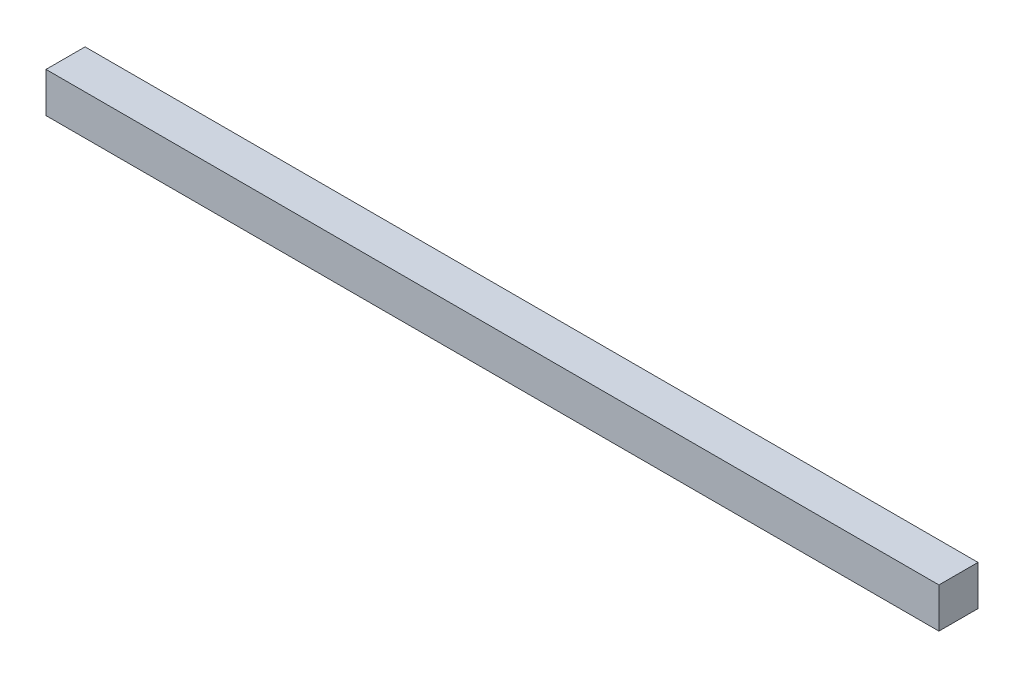
ISO-10303-21;
HEADER;
FILE_DESCRIPTION(('STEP AP214'),'2;1');
FILE_NAME('part.step','',(''),(''),'','','');
FILE_SCHEMA(('AUTOMOTIVE_DESIGN { 1 0 10303 214 1 1 1 1 }'));
ENDSEC;
DATA;
#1=APPLICATION_CONTEXT('core data for automotive mechanical design processes');
#2=APPLICATION_PROTOCOL_DEFINITION('international standard','automotive_design',2000,#1);
#3=PRODUCT_CONTEXT('',#1,'mechanical');
#4=PRODUCT('Part','Part','',(#3));
#5=PRODUCT_RELATED_PRODUCT_CATEGORY('part','',(#4));
#6=PRODUCT_DEFINITION_FORMATION('','',#4);
#7=PRODUCT_DEFINITION_CONTEXT('part definition',#1,'design');
#8=PRODUCT_DEFINITION('design','',#6,#7);
#9=PRODUCT_DEFINITION_SHAPE('','',#8);
#10=(LENGTH_UNIT() NAMED_UNIT(*) SI_UNIT(.MILLI.,.METRE.));
#11=(NAMED_UNIT(*) PLANE_ANGLE_UNIT() SI_UNIT($,.RADIAN.));
#12=(NAMED_UNIT(*) SI_UNIT($,.STERADIAN.) SOLID_ANGLE_UNIT());
#13=UNCERTAINTY_MEASURE_WITH_UNIT(LENGTH_MEASURE(1.E-05),#10,'distance_accuracy_value','');
#14=(GEOMETRIC_REPRESENTATION_CONTEXT(3) GLOBAL_UNCERTAINTY_ASSIGNED_CONTEXT((#13)) GLOBAL_UNIT_ASSIGNED_CONTEXT((#10,
#11,#12)) REPRESENTATION_CONTEXT('',''));
#15=CARTESIAN_POINT('',(0.,0.,0.));
#16=DIRECTION('',(0.,0.,1.));
#17=DIRECTION('',(1.,0.,0.));
#18=AXIS2_PLACEMENT_3D('',#15,#16,#17);
#19=CARTESIAN_POINT('',(-0.099999999999989,3.07499999999996,6.));
#20=DIRECTION('',(1.,0.,0.));
#21=DIRECTION('',(0.,1.,0.));
#22=AXIS2_PLACEMENT_3D('',#19,#20,#21);
#23=PLANE('',#22);
#24=DIRECTION('',(0.,-1.,0.));
#25=VECTOR('',#24,1.);
#26=CARTESIAN_POINT('',(-0.099999999999989,3.07499999999996,0.));
#27=LINE('',#26,#25);
#28=CARTESIAN_POINT('',(-0.099999999999989,3.07499999999996,0.));
#29=VERTEX_POINT('',#28);
#30=CARTESIAN_POINT('',(-0.0999999999999943,-3.07500000000001,0.));
#31=VERTEX_POINT('',#30);
#32=EDGE_CURVE('E104',#29,#31,#27,.T.);
#33=ORIENTED_EDGE('',*,*,#32,.T.);
#34=DIRECTION('',(0.,0.,-1.));
#35=VECTOR('',#34,1.);
#36=CARTESIAN_POINT('',(-0.0999999999999943,-3.07500000000001,6.));
#37=LINE('',#36,#35);
#38=CARTESIAN_POINT('',(-0.0999999999999943,-3.07500000000001,6.));
#39=VERTEX_POINT('',#38);
#40=EDGE_CURVE('E11',#39,#31,#37,.T.);
#41=ORIENTED_EDGE('',*,*,#40,.F.);
#42=DIRECTION('',(0.,-1.,0.));
#43=VECTOR('',#42,1.);
#44=CARTESIAN_POINT('',(-0.099999999999989,3.07499999999996,6.));
#45=LINE('',#44,#43);
#46=CARTESIAN_POINT('',(-0.099999999999989,3.07499999999996,6.));
#47=VERTEX_POINT('',#46);
#48=EDGE_CURVE('E92',#47,#39,#45,.T.);
#49=ORIENTED_EDGE('',*,*,#48,.F.);
#50=DIRECTION('',(0.,0.,-1.));
#51=VECTOR('',#50,1.);
#52=CARTESIAN_POINT('',(-0.099999999999989,3.07499999999996,6.));
#53=LINE('',#52,#51);
#54=EDGE_CURVE('E100',#47,#29,#53,.T.);
#55=ORIENTED_EDGE('',*,*,#54,.T.);
#56=EDGE_LOOP('',(#33,#41,#49,#55));
#57=FACE_BOUND('',#56,.T.);
#58=ADVANCED_FACE('F41',(#57),#23,.F.);
#59=CARTESIAN_POINT('',(-0.0999999999999943,-3.07500000000001,6.));
#60=DIRECTION('',(0.,1.,0.));
#61=DIRECTION('',(-1.,0.,0.));
#62=AXIS2_PLACEMENT_3D('',#59,#60,#61);
#63=PLANE('',#62);
#64=DIRECTION('',(1.,0.,0.));
#65=VECTOR('',#64,1.);
#66=CARTESIAN_POINT('',(-0.0999999999999943,-3.07500000000001,0.));
#67=LINE('',#66,#65);
#68=CARTESIAN_POINT('',(137.075,-3.07500000000001,0.));
#69=VERTEX_POINT('',#68);
#70=EDGE_CURVE('E96',#31,#69,#67,.T.);
#71=ORIENTED_EDGE('',*,*,#70,.T.);
#72=DIRECTION('',(0.,0.,-1.));
#73=VECTOR('',#72,1.);
#74=CARTESIAN_POINT('',(137.075,-3.07500000000001,6.));
#75=LINE('',#74,#73);
#76=CARTESIAN_POINT('',(137.075,-3.07500000000001,6.));
#77=VERTEX_POINT('',#76);
#78=EDGE_CURVE('E49',#77,#69,#75,.T.);
#79=ORIENTED_EDGE('',*,*,#78,.F.);
#80=DIRECTION('',(1.,0.,0.));
#81=VECTOR('',#80,1.);
#82=CARTESIAN_POINT('',(-0.0999999999999943,-3.07500000000001,6.));
#83=LINE('',#82,#81);
#84=EDGE_CURVE('E87',#39,#77,#83,.T.);
#85=ORIENTED_EDGE('',*,*,#84,.F.);
#86=ORIENTED_EDGE('',*,*,#40,.T.);
#87=EDGE_LOOP('',(#71,#79,#85,#86));
#88=FACE_BOUND('',#87,.T.);
#89=ADVANCED_FACE('F95',(#88),#63,.F.);
#90=CARTESIAN_POINT('',(137.075,-3.07500000000001,6.));
#91=DIRECTION('',(-1.,0.,0.));
#92=DIRECTION('',(0.,0.,1.));
#93=AXIS2_PLACEMENT_3D('',#90,#91,#92);
#94=PLANE('',#93);
#95=DIRECTION('',(0.,1.,0.));
#96=VECTOR('',#95,1.);
#97=CARTESIAN_POINT('',(137.075,-3.07500000000001,0.));
#98=LINE('',#97,#96);
#99=CARTESIAN_POINT('',(137.075,3.07499999999998,0.));
#100=VERTEX_POINT('',#99);
#101=EDGE_CURVE('E74',#69,#100,#98,.T.);
#102=ORIENTED_EDGE('',*,*,#101,.T.);
#103=DIRECTION('',(0.,0.,-1.));
#104=VECTOR('',#103,1.);
#105=CARTESIAN_POINT('',(137.075,3.07499999999998,6.));
#106=LINE('',#105,#104);
#107=CARTESIAN_POINT('',(137.075,3.07499999999998,6.));
#108=VERTEX_POINT('',#107);
#109=EDGE_CURVE('E97',#108,#100,#106,.T.);
#110=ORIENTED_EDGE('',*,*,#109,.F.);
#111=DIRECTION('',(0.,1.,0.));
#112=VECTOR('',#111,1.);
#113=CARTESIAN_POINT('',(137.075,-3.07500000000001,6.));
#114=LINE('',#113,#112);
#115=EDGE_CURVE('E90',#77,#108,#114,.T.);
#116=ORIENTED_EDGE('',*,*,#115,.F.);
#117=ORIENTED_EDGE('',*,*,#78,.T.);
#118=EDGE_LOOP('',(#102,#110,#116,#117));
#119=FACE_BOUND('',#118,.T.);
#120=ADVANCED_FACE('F98',(#119),#94,.F.);
#121=CARTESIAN_POINT('',(137.075,3.07499999999998,6.));
#122=DIRECTION('',(0.,-1.,0.));
#123=DIRECTION('',(1.,0.,0.));
#124=AXIS2_PLACEMENT_3D('',#121,#122,#123);
#125=PLANE('',#124);
#126=DIRECTION('',(-1.,0.,0.));
#127=VECTOR('',#126,1.);
#128=CARTESIAN_POINT('',(137.075,3.07499999999998,0.));
#129=LINE('',#128,#127);
#130=EDGE_CURVE('E80',#100,#29,#129,.T.);
#131=ORIENTED_EDGE('',*,*,#130,.T.);
#132=ORIENTED_EDGE('',*,*,#54,.F.);
#133=DIRECTION('',(-1.,0.,0.));
#134=VECTOR('',#133,1.);
#135=CARTESIAN_POINT('',(137.075,3.07499999999998,6.));
#136=LINE('',#135,#134);
#137=EDGE_CURVE('E57',#108,#47,#136,.T.);
#138=ORIENTED_EDGE('',*,*,#137,.F.);
#139=ORIENTED_EDGE('',*,*,#109,.T.);
#140=EDGE_LOOP('',(#131,#132,#138,#139));
#141=FACE_BOUND('',#140,.T.);
#142=ADVANCED_FACE('F111',(#141),#125,.F.);
#143=CARTESIAN_POINT('',(0.,0.,6.));
#144=DIRECTION('',(0.,0.,1.));
#145=DIRECTION('',(1.,0.,0.));
#146=AXIS2_PLACEMENT_3D('',#143,#144,#145);
#147=PLANE('',#146);
#148=ORIENTED_EDGE('',*,*,#48,.T.);
#149=ORIENTED_EDGE('',*,*,#84,.T.);
#150=ORIENTED_EDGE('',*,*,#115,.T.);
#151=ORIENTED_EDGE('',*,*,#137,.T.);
#152=EDGE_LOOP('',(#148,#149,#150,#151));
#153=FACE_BOUND('',#152,.T.);
#154=ADVANCED_FACE('F88',(#153),#147,.T.);
#155=CARTESIAN_POINT('',(0.,0.,0.));
#156=DIRECTION('',(0.,0.,1.));
#157=DIRECTION('',(1.,0.,0.));
#158=AXIS2_PLACEMENT_3D('',#155,#156,#157);
#159=PLANE('',#158);
#160=ORIENTED_EDGE('',*,*,#32,.F.);
#161=ORIENTED_EDGE('',*,*,#130,.F.);
#162=ORIENTED_EDGE('',*,*,#101,.F.);
#163=ORIENTED_EDGE('',*,*,#70,.F.);
#164=EDGE_LOOP('',(#160,#161,#162,#163));
#165=FACE_BOUND('',#164,.T.);
#166=ADVANCED_FACE('F114',(#165),#159,.F.);
#167=CLOSED_SHELL('',(#58,#89,#120,#142,#154,#166));
#168=MANIFOLD_SOLID_BREP('B2',#167);
#169=ADVANCED_BREP_SHAPE_REPRESENTATION('',(#18,#168),#14);
#170=SHAPE_DEFINITION_REPRESENTATION(#9,#169);
ENDSEC;
END-ISO-10303-21;
